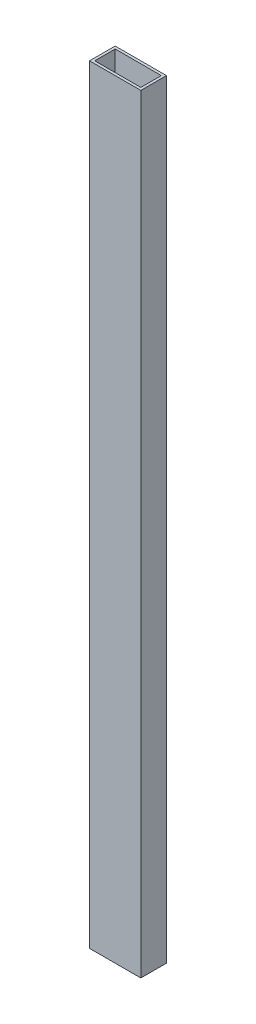
ISO-10303-21;
HEADER;
FILE_DESCRIPTION(('STEP AP214'),'2;1');
FILE_NAME('part.step','',(''),(''),'','','');
FILE_SCHEMA(('AUTOMOTIVE_DESIGN { 1 0 10303 214 1 1 1 1 }'));
ENDSEC;
DATA;
#1=APPLICATION_CONTEXT('core data for automotive mechanical design processes');
#2=APPLICATION_PROTOCOL_DEFINITION('international standard','automotive_design',2000,#1);
#3=PRODUCT_CONTEXT('',#1,'mechanical');
#4=PRODUCT('Part','Part','',(#3));
#5=PRODUCT_RELATED_PRODUCT_CATEGORY('part','',(#4));
#6=PRODUCT_DEFINITION_FORMATION('','',#4);
#7=PRODUCT_DEFINITION_CONTEXT('part definition',#1,'design');
#8=PRODUCT_DEFINITION('design','',#6,#7);
#9=PRODUCT_DEFINITION_SHAPE('','',#8);
#10=(LENGTH_UNIT() NAMED_UNIT(*) SI_UNIT(.MILLI.,.METRE.));
#11=(NAMED_UNIT(*) PLANE_ANGLE_UNIT() SI_UNIT($,.RADIAN.));
#12=(NAMED_UNIT(*) SI_UNIT($,.STERADIAN.) SOLID_ANGLE_UNIT());
#13=UNCERTAINTY_MEASURE_WITH_UNIT(LENGTH_MEASURE(1.E-05),#10,'distance_accuracy_value','');
#14=(GEOMETRIC_REPRESENTATION_CONTEXT(3) GLOBAL_UNCERTAINTY_ASSIGNED_CONTEXT((#13)) GLOBAL_UNIT_ASSIGNED_CONTEXT((#10,
#11,#12)) REPRESENTATION_CONTEXT('',''));
#15=CARTESIAN_POINT('',(0.,0.,0.));
#16=DIRECTION('',(0.,0.,1.));
#17=DIRECTION('',(1.,0.,0.));
#18=AXIS2_PLACEMENT_3D('',#15,#16,#17);
#19=CARTESIAN_POINT('',(0.,762.,0.));
#20=DIRECTION('',(1.,0.,0.));
#21=DIRECTION('',(0.,0.,-1.));
#22=AXIS2_PLACEMENT_3D('',#19,#20,#21);
#23=PLANE('',#22);
#24=DIRECTION('',(0.,0.,1.));
#25=VECTOR('',#24,1.);
#26=CARTESIAN_POINT('',(0.,0.,0.));
#27=LINE('',#26,#25);
#28=CARTESIAN_POINT('',(0.,0.,-25.4));
#29=VERTEX_POINT('',#28);
#30=CARTESIAN_POINT('',(0.,0.,0.));
#31=VERTEX_POINT('',#30);
#32=EDGE_CURVE('E147',#29,#31,#27,.T.);
#33=ORIENTED_EDGE('',*,*,#32,.T.);
#34=DIRECTION('',(0.,-1.,0.));
#35=VECTOR('',#34,1.);
#36=CARTESIAN_POINT('',(0.,762.,0.));
#37=LINE('',#36,#35);
#38=CARTESIAN_POINT('',(0.,762.,0.));
#39=VERTEX_POINT('',#38);
#40=EDGE_CURVE('E11',#39,#31,#37,.T.);
#41=ORIENTED_EDGE('',*,*,#40,.F.);
#42=DIRECTION('',(0.,0.,1.));
#43=VECTOR('',#42,1.);
#44=CARTESIAN_POINT('',(0.,762.,0.));
#45=LINE('',#44,#43);
#46=CARTESIAN_POINT('',(0.,762.,-25.4));
#47=VERTEX_POINT('',#46);
#48=EDGE_CURVE('E153',#47,#39,#45,.T.);
#49=ORIENTED_EDGE('',*,*,#48,.F.);
#50=DIRECTION('',(0.,-1.,0.));
#51=VECTOR('',#50,1.);
#52=CARTESIAN_POINT('',(0.,762.,-25.4));
#53=LINE('',#52,#51);
#54=EDGE_CURVE('E167',#47,#29,#53,.T.);
#55=ORIENTED_EDGE('',*,*,#54,.T.);
#56=EDGE_LOOP('',(#33,#41,#49,#55));
#57=FACE_BOUND('',#56,.T.);
#58=ADVANCED_FACE('F39',(#57),#23,.F.);
#59=CARTESIAN_POINT('',(0.,762.,0.));
#60=DIRECTION('',(0.,0.,-1.));
#61=DIRECTION('',(-1.,0.,0.));
#62=AXIS2_PLACEMENT_3D('',#59,#60,#61);
#63=PLANE('',#62);
#64=DIRECTION('',(1.,0.,0.));
#65=VECTOR('',#64,1.);
#66=CARTESIAN_POINT('',(0.,0.,0.));
#67=LINE('',#66,#65);
#68=CARTESIAN_POINT('',(50.8,0.,0.));
#69=VERTEX_POINT('',#68);
#70=EDGE_CURVE('E171',#31,#69,#67,.T.);
#71=ORIENTED_EDGE('',*,*,#70,.T.);
#72=DIRECTION('',(0.,-1.,0.));
#73=VECTOR('',#72,1.);
#74=CARTESIAN_POINT('',(50.8,762.,0.));
#75=LINE('',#74,#73);
#76=CARTESIAN_POINT('',(50.8,762.,0.));
#77=VERTEX_POINT('',#76);
#78=EDGE_CURVE('E47',#77,#69,#75,.T.);
#79=ORIENTED_EDGE('',*,*,#78,.F.);
#80=DIRECTION('',(1.,0.,0.));
#81=VECTOR('',#80,1.);
#82=CARTESIAN_POINT('',(0.,762.,0.));
#83=LINE('',#82,#81);
#84=EDGE_CURVE('E157',#39,#77,#83,.T.);
#85=ORIENTED_EDGE('',*,*,#84,.F.);
#86=ORIENTED_EDGE('',*,*,#40,.T.);
#87=EDGE_LOOP('',(#71,#79,#85,#86));
#88=FACE_BOUND('',#87,.T.);
#89=ADVANCED_FACE('F205',(#88),#63,.F.);
#90=CARTESIAN_POINT('',(50.8,762.,0.));
#91=DIRECTION('',(-1.,0.,0.));
#92=DIRECTION('',(0.,0.,1.));
#93=AXIS2_PLACEMENT_3D('',#90,#91,#92);
#94=PLANE('',#93);
#95=DIRECTION('',(0.,0.,-1.));
#96=VECTOR('',#95,1.);
#97=CARTESIAN_POINT('',(50.8,0.,0.));
#98=LINE('',#97,#96);
#99=CARTESIAN_POINT('',(50.8,0.,-25.4));
#100=VERTEX_POINT('',#99);
#101=EDGE_CURVE('E174',#69,#100,#98,.T.);
#102=ORIENTED_EDGE('',*,*,#101,.T.);
#103=DIRECTION('',(0.,-1.,0.));
#104=VECTOR('',#103,1.);
#105=CARTESIAN_POINT('',(50.8,762.,-25.4));
#106=LINE('',#105,#104);
#107=CARTESIAN_POINT('',(50.8,762.,-25.4));
#108=VERTEX_POINT('',#107);
#109=EDGE_CURVE('E182',#108,#100,#106,.T.);
#110=ORIENTED_EDGE('',*,*,#109,.F.);
#111=DIRECTION('',(0.,0.,-1.));
#112=VECTOR('',#111,1.);
#113=CARTESIAN_POINT('',(50.8,762.,0.));
#114=LINE('',#113,#112);
#115=EDGE_CURVE('E161',#77,#108,#114,.T.);
#116=ORIENTED_EDGE('',*,*,#115,.F.);
#117=ORIENTED_EDGE('',*,*,#78,.T.);
#118=EDGE_LOOP('',(#102,#110,#116,#117));
#119=FACE_BOUND('',#118,.T.);
#120=ADVANCED_FACE('F191',(#119),#94,.F.);
#121=CARTESIAN_POINT('',(0.,762.,-25.4));
#122=DIRECTION('',(0.,0.,1.));
#123=DIRECTION('',(1.,0.,0.));
#124=AXIS2_PLACEMENT_3D('',#121,#122,#123);
#125=PLANE('',#124);
#126=DIRECTION('',(-1.,0.,0.));
#127=VECTOR('',#126,1.);
#128=CARTESIAN_POINT('',(0.,0.,-25.4));
#129=LINE('',#128,#127);
#130=EDGE_CURVE('E158',#100,#29,#129,.T.);
#131=ORIENTED_EDGE('',*,*,#130,.T.);
#132=ORIENTED_EDGE('',*,*,#54,.F.);
#133=DIRECTION('',(-1.,0.,0.));
#134=VECTOR('',#133,1.);
#135=CARTESIAN_POINT('',(0.,762.,-25.4));
#136=LINE('',#135,#134);
#137=EDGE_CURVE('E164',#108,#47,#136,.T.);
#138=ORIENTED_EDGE('',*,*,#137,.F.);
#139=ORIENTED_EDGE('',*,*,#109,.T.);
#140=EDGE_LOOP('',(#131,#132,#138,#139));
#141=FACE_BOUND('',#140,.T.);
#142=ADVANCED_FACE('F198',(#141),#125,.F.);
#143=CARTESIAN_POINT('',(0.,762.,0.));
#144=DIRECTION('',(0.,-1.,0.));
#145=DIRECTION('',(0.,0.,-1.));
#146=AXIS2_PLACEMENT_3D('',#143,#144,#145);
#147=PLANE('',#146);
#148=DIRECTION('',(-1.,0.,0.));
#149=VECTOR('',#148,1.);
#150=CARTESIAN_POINT('',(2.53999999999999,762.,-22.86));
#151=LINE('',#150,#149);
#152=CARTESIAN_POINT('',(48.26,762.,-22.86));
#153=VERTEX_POINT('',#152);
#154=CARTESIAN_POINT('',(2.53999999999999,762.,-22.86));
#155=VERTEX_POINT('',#154);
#156=EDGE_CURVE('E138',#153,#155,#151,.T.);
#157=ORIENTED_EDGE('',*,*,#156,.F.);
#158=DIRECTION('',(0.,0.,-1.));
#159=VECTOR('',#158,1.);
#160=CARTESIAN_POINT('',(48.26,762.,-22.86));
#161=LINE('',#160,#159);
#162=CARTESIAN_POINT('',(48.26,762.,-2.54));
#163=VERTEX_POINT('',#162);
#164=EDGE_CURVE('E54',#163,#153,#161,.T.);
#165=ORIENTED_EDGE('',*,*,#164,.F.);
#166=DIRECTION('',(1.,0.,0.));
#167=VECTOR('',#166,1.);
#168=CARTESIAN_POINT('',(2.53999999999999,762.,-2.54));
#169=LINE('',#168,#167);
#170=CARTESIAN_POINT('',(2.53999999999999,762.,-2.54));
#171=VERTEX_POINT('',#170);
#172=EDGE_CURVE('E125',#171,#163,#169,.T.);
#173=ORIENTED_EDGE('',*,*,#172,.F.);
#174=DIRECTION('',(0.,0.,1.));
#175=VECTOR('',#174,1.);
#176=CARTESIAN_POINT('',(2.53999999999999,762.,-22.86));
#177=LINE('',#176,#175);
#178=EDGE_CURVE('E129',#155,#171,#177,.T.);
#179=ORIENTED_EDGE('',*,*,#178,.F.);
#180=EDGE_LOOP('',(#157,#165,#173,#179));
#181=FACE_BOUND('',#180,.T.);
#182=ORIENTED_EDGE('',*,*,#48,.T.);
#183=ORIENTED_EDGE('',*,*,#84,.T.);
#184=ORIENTED_EDGE('',*,*,#115,.T.);
#185=ORIENTED_EDGE('',*,*,#137,.T.);
#186=EDGE_LOOP('',(#182,#183,#184,#185));
#187=FACE_BOUND('',#186,.T.);
#188=ADVANCED_FACE('F204',(#181,#187),#147,.F.);
#189=CARTESIAN_POINT('',(0.,0.,0.));
#190=DIRECTION('',(0.,-1.,0.));
#191=DIRECTION('',(0.,0.,-1.));
#192=AXIS2_PLACEMENT_3D('',#189,#190,#191);
#193=PLANE('',#192);
#194=DIRECTION('',(0.,0.,-1.));
#195=VECTOR('',#194,1.);
#196=CARTESIAN_POINT('',(48.26,0.,-22.86));
#197=LINE('',#196,#195);
#198=CARTESIAN_POINT('',(48.26,0.,-2.54));
#199=VERTEX_POINT('',#198);
#200=CARTESIAN_POINT('',(48.26,0.,-22.86));
#201=VERTEX_POINT('',#200);
#202=EDGE_CURVE('E106',#199,#201,#197,.T.);
#203=ORIENTED_EDGE('',*,*,#202,.T.);
#204=DIRECTION('',(-1.,0.,0.));
#205=VECTOR('',#204,1.);
#206=CARTESIAN_POINT('',(2.53999999999999,0.,-22.86));
#207=LINE('',#206,#205);
#208=CARTESIAN_POINT('',(2.53999999999999,0.,-22.86));
#209=VERTEX_POINT('',#208);
#210=EDGE_CURVE('E116',#201,#209,#207,.T.);
#211=ORIENTED_EDGE('',*,*,#210,.T.);
#212=DIRECTION('',(0.,0.,1.));
#213=VECTOR('',#212,1.);
#214=CARTESIAN_POINT('',(2.53999999999999,0.,-22.86));
#215=LINE('',#214,#213);
#216=CARTESIAN_POINT('',(2.53999999999999,0.,-2.54));
#217=VERTEX_POINT('',#216);
#218=EDGE_CURVE('E62',#209,#217,#215,.T.);
#219=ORIENTED_EDGE('',*,*,#218,.T.);
#220=DIRECTION('',(1.,0.,0.));
#221=VECTOR('',#220,1.);
#222=CARTESIAN_POINT('',(2.53999999999999,0.,-2.54));
#223=LINE('',#222,#221);
#224=EDGE_CURVE('E113',#217,#199,#223,.T.);
#225=ORIENTED_EDGE('',*,*,#224,.T.);
#226=EDGE_LOOP('',(#203,#211,#219,#225));
#227=FACE_BOUND('',#226,.T.);
#228=ORIENTED_EDGE('',*,*,#32,.F.);
#229=ORIENTED_EDGE('',*,*,#130,.F.);
#230=ORIENTED_EDGE('',*,*,#101,.F.);
#231=ORIENTED_EDGE('',*,*,#70,.F.);
#232=EDGE_LOOP('',(#228,#229,#230,#231));
#233=FACE_BOUND('',#232,.T.);
#234=ADVANCED_FACE('F121',(#227,#233),#193,.T.);
#235=CARTESIAN_POINT('',(48.26,0.,-22.86));
#236=DIRECTION('',(1.,0.,0.));
#237=DIRECTION('',(0.,0.,-1.));
#238=AXIS2_PLACEMENT_3D('',#235,#236,#237);
#239=PLANE('',#238);
#240=ORIENTED_EDGE('',*,*,#164,.T.);
#241=DIRECTION('',(0.,1.,0.));
#242=VECTOR('',#241,1.);
#243=CARTESIAN_POINT('',(48.26,0.,-22.86));
#244=LINE('',#243,#242);
#245=EDGE_CURVE('E102',#201,#153,#244,.T.);
#246=ORIENTED_EDGE('',*,*,#245,.F.);
#247=ORIENTED_EDGE('',*,*,#202,.F.);
#248=DIRECTION('',(0.,1.,0.));
#249=VECTOR('',#248,1.);
#250=CARTESIAN_POINT('',(48.26,0.,-2.54));
#251=LINE('',#250,#249);
#252=EDGE_CURVE('E144',#199,#163,#251,.T.);
#253=ORIENTED_EDGE('',*,*,#252,.T.);
#254=EDGE_LOOP('',(#240,#246,#247,#253));
#255=FACE_BOUND('',#254,.T.);
#256=ADVANCED_FACE('F104',(#255),#239,.F.);
#257=CARTESIAN_POINT('',(2.53999999999999,0.,-2.54));
#258=DIRECTION('',(0.,0.,1.));
#259=DIRECTION('',(1.,0.,0.));
#260=AXIS2_PLACEMENT_3D('',#257,#258,#259);
#261=PLANE('',#260);
#262=ORIENTED_EDGE('',*,*,#172,.T.);
#263=ORIENTED_EDGE('',*,*,#252,.F.);
#264=ORIENTED_EDGE('',*,*,#224,.F.);
#265=DIRECTION('',(0.,1.,0.));
#266=VECTOR('',#265,1.);
#267=CARTESIAN_POINT('',(2.53999999999999,0.,-2.54));
#268=LINE('',#267,#266);
#269=EDGE_CURVE('E148',#217,#171,#268,.T.);
#270=ORIENTED_EDGE('',*,*,#269,.T.);
#271=EDGE_LOOP('',(#262,#263,#264,#270));
#272=FACE_BOUND('',#271,.T.);
#273=ADVANCED_FACE('F222',(#272),#261,.F.);
#274=CARTESIAN_POINT('',(2.53999999999999,0.,-22.86));
#275=DIRECTION('',(-1.,0.,0.));
#276=DIRECTION('',(0.,0.,1.));
#277=AXIS2_PLACEMENT_3D('',#274,#275,#276);
#278=PLANE('',#277);
#279=ORIENTED_EDGE('',*,*,#178,.T.);
#280=ORIENTED_EDGE('',*,*,#269,.F.);
#281=ORIENTED_EDGE('',*,*,#218,.F.);
#282=DIRECTION('',(0.,1.,0.));
#283=VECTOR('',#282,1.);
#284=CARTESIAN_POINT('',(2.53999999999999,0.,-22.86));
#285=LINE('',#284,#283);
#286=EDGE_CURVE('E112',#209,#155,#285,.T.);
#287=ORIENTED_EDGE('',*,*,#286,.T.);
#288=EDGE_LOOP('',(#279,#280,#281,#287));
#289=FACE_BOUND('',#288,.T.);
#290=ADVANCED_FACE('F225',(#289),#278,.F.);
#291=CARTESIAN_POINT('',(2.53999999999999,0.,-22.86));
#292=DIRECTION('',(0.,0.,-1.));
#293=DIRECTION('',(-1.,0.,0.));
#294=AXIS2_PLACEMENT_3D('',#291,#292,#293);
#295=PLANE('',#294);
#296=ORIENTED_EDGE('',*,*,#156,.T.);
#297=ORIENTED_EDGE('',*,*,#286,.F.);
#298=ORIENTED_EDGE('',*,*,#210,.F.);
#299=ORIENTED_EDGE('',*,*,#245,.T.);
#300=EDGE_LOOP('',(#296,#297,#298,#299));
#301=FACE_BOUND('',#300,.T.);
#302=ADVANCED_FACE('F117',(#301),#295,.F.);
#303=CLOSED_SHELL('',(#58,#89,#120,#142,#188,#234,#256,#273,#290,#302));
#304=MANIFOLD_SOLID_BREP('B2',#303);
#305=ADVANCED_BREP_SHAPE_REPRESENTATION('',(#18,#304),#14);
#306=SHAPE_DEFINITION_REPRESENTATION(#9,#305);
ENDSEC;
END-ISO-10303-21;
